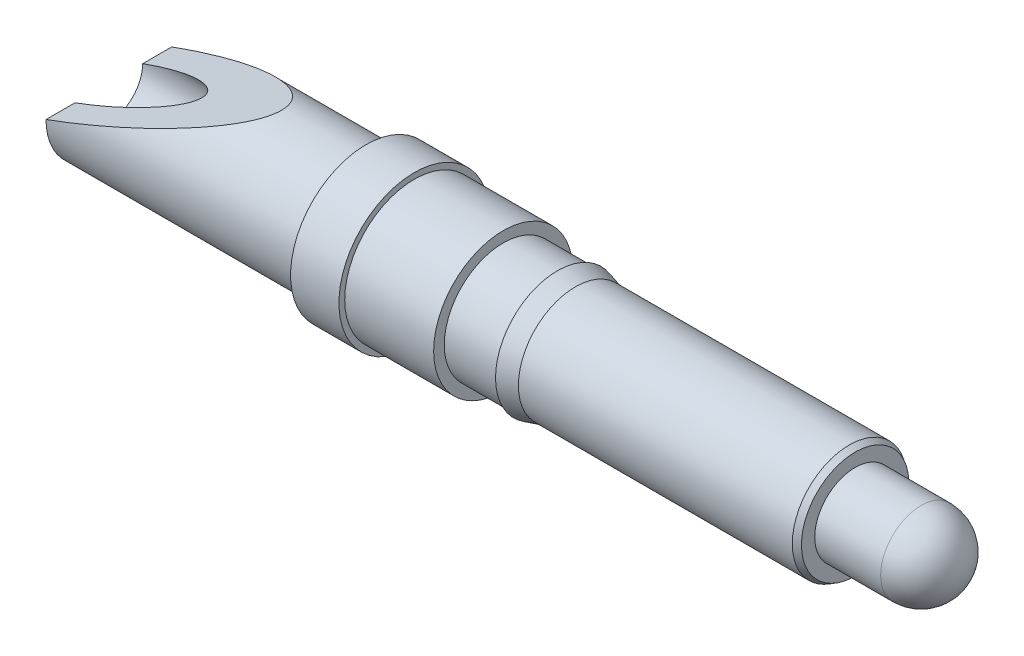
ISO-10303-21;
HEADER;
FILE_DESCRIPTION(('STEP AP214'),'2;1');
FILE_NAME('part.step','',(''),(''),'','','');
FILE_SCHEMA(('AUTOMOTIVE_DESIGN { 1 0 10303 214 1 1 1 1 }'));
ENDSEC;
DATA;
#1=APPLICATION_CONTEXT('core data for automotive mechanical design processes');
#2=APPLICATION_PROTOCOL_DEFINITION('international standard','automotive_design',2000,#1);
#3=PRODUCT_CONTEXT('',#1,'mechanical');
#4=PRODUCT('Part','Part','',(#3));
#5=PRODUCT_RELATED_PRODUCT_CATEGORY('part','',(#4));
#6=PRODUCT_DEFINITION_FORMATION('','',#4);
#7=PRODUCT_DEFINITION_CONTEXT('part definition',#1,'design');
#8=PRODUCT_DEFINITION('design','',#6,#7);
#9=PRODUCT_DEFINITION_SHAPE('','',#8);
#10=(LENGTH_UNIT() NAMED_UNIT(*) SI_UNIT(.MILLI.,.METRE.));
#11=(NAMED_UNIT(*) PLANE_ANGLE_UNIT() SI_UNIT($,.RADIAN.));
#12=(NAMED_UNIT(*) SI_UNIT($,.STERADIAN.) SOLID_ANGLE_UNIT());
#13=UNCERTAINTY_MEASURE_WITH_UNIT(LENGTH_MEASURE(1.E-05),#10,'distance_accuracy_value','');
#14=(GEOMETRIC_REPRESENTATION_CONTEXT(3) GLOBAL_UNCERTAINTY_ASSIGNED_CONTEXT((#13)) GLOBAL_UNIT_ASSIGNED_CONTEXT((#10,
#11,#12)) REPRESENTATION_CONTEXT('',''));
#15=CARTESIAN_POINT('',(0.,0.,0.));
#16=DIRECTION('',(0.,0.,1.));
#17=DIRECTION('',(1.,0.,0.));
#18=AXIS2_PLACEMENT_3D('',#15,#16,#17);
#19=CARTESIAN_POINT('',(5.79120000000002,0.705305909487725,0.));
#20=DIRECTION('',(-1.,0.,0.));
#21=DIRECTION('',(0.,0.,1.));
#22=AXIS2_PLACEMENT_3D('',#19,#20,#21);
#23=PLANE('',#22);
#24=CARTESIAN_POINT('',(5.79120000000002,0.,0.));
#25=DIRECTION('',(-1.,0.,0.));
#26=DIRECTION('',(0.,0.,1.));
#27=AXIS2_PLACEMENT_3D('',#24,#25,#26);
#28=CIRCLE('',#27,0.530859999999994);
#29=CARTESIAN_POINT('',(5.79120000000002,0.,0.530859999999994));
#30=VERTEX_POINT('',#29);
#31=EDGE_CURVE('E52',#30,#30,#28,.T.);
#32=ORIENTED_EDGE('',*,*,#31,.T.);
#33=EDGE_LOOP('',(#32));
#34=FACE_BOUND('',#33,.T.);
#35=CARTESIAN_POINT('',(5.79120000000001,0.,0.));
#36=DIRECTION('',(-1.,0.,0.));
#37=DIRECTION('',(0.,0.,1.));
#38=AXIS2_PLACEMENT_3D('',#35,#36,#37);
#39=CIRCLE('',#38,0.705305909487725);
#40=CARTESIAN_POINT('',(5.79120000000001,0.,0.705305909487725));
#41=VERTEX_POINT('',#40);
#42=EDGE_CURVE('E113',#41,#41,#39,.T.);
#43=ORIENTED_EDGE('',*,*,#42,.F.);
#44=EDGE_LOOP('',(#43));
#45=FACE_BOUND('',#44,.T.);
#46=ADVANCED_FACE('F44',(#34,#45),#23,.F.);
#47=CARTESIAN_POINT('',(5.79120000000001,0.,0.));
#48=DIRECTION('',(-1.,0.,0.));
#49=DIRECTION('',(0.,0.,1.));
#50=AXIS2_PLACEMENT_3D('',#47,#48,#49);
#51=CONICAL_SURFACE('',#50,0.705305909487725,0.523598775598293);
#52=CARTESIAN_POINT('',(5.715,0.,0.));
#53=DIRECTION('',(-1.,0.,0.));
#54=DIRECTION('',(0.,0.,1.));
#55=AXIS2_PLACEMENT_3D('',#52,#53,#54);
#56=CIRCLE('',#55,0.749299999999981);
#57=CARTESIAN_POINT('',(5.715,0.,0.749299999999981));
#58=VERTEX_POINT('',#57);
#59=EDGE_CURVE('E109',#58,#58,#56,.T.);
#60=ORIENTED_EDGE('',*,*,#59,.F.);
#61=EDGE_LOOP('',(#60));
#62=FACE_BOUND('',#61,.T.);
#63=ORIENTED_EDGE('',*,*,#42,.T.);
#64=EDGE_LOOP('',(#63));
#65=FACE_BOUND('',#64,.T.);
#66=ADVANCED_FACE('F164',(#62,#65),#51,.T.);
#67=CARTESIAN_POINT('',(0.,0.,0.));
#68=DIRECTION('',(-1.,0.,0.));
#69=DIRECTION('',(0.,0.,1.));
#70=AXIS2_PLACEMENT_3D('',#67,#68,#69);
#71=CYLINDRICAL_SURFACE('',#70,0.749299999999981);
#72=CARTESIAN_POINT('',(2.11658522628074,0.,0.));
#73=DIRECTION('',(-1.,0.,0.));
#74=DIRECTION('',(0.,0.,1.));
#75=AXIS2_PLACEMENT_3D('',#72,#73,#74);
#76=CIRCLE('',#75,0.749299999999981);
#77=CARTESIAN_POINT('',(2.11658522628074,0.,0.749299999999981));
#78=VERTEX_POINT('',#77);
#79=EDGE_CURVE('E105',#78,#78,#76,.T.);
#80=ORIENTED_EDGE('',*,*,#79,.F.);
#81=EDGE_LOOP('',(#80));
#82=FACE_BOUND('',#81,.T.);
#83=ORIENTED_EDGE('',*,*,#59,.T.);
#84=EDGE_LOOP('',(#83));
#85=FACE_BOUND('',#84,.T.);
#86=ADVANCED_FACE('F169',(#82,#85),#71,.T.);
#87=CARTESIAN_POINT('',(2.11658522628074,0.,0.));
#88=DIRECTION('',(-1.,0.,0.));
#89=DIRECTION('',(0.,0.,1.));
#90=AXIS2_PLACEMENT_3D('',#87,#88,#89);
#91=CONICAL_SURFACE('',#90,0.749299999999981,0.261799387799215);
#92=CARTESIAN_POINT('',(1.8796,0.,0.));
#93=DIRECTION('',(-1.,0.,0.));
#94=DIRECTION('',(0.,0.,1.));
#95=AXIS2_PLACEMENT_3D('',#92,#93,#94);
#96=CIRCLE('',#95,0.81280000000003);
#97=CARTESIAN_POINT('',(1.8796,0.,0.81280000000003));
#98=VERTEX_POINT('',#97);
#99=EDGE_CURVE('E101',#98,#98,#96,.T.);
#100=ORIENTED_EDGE('',*,*,#99,.F.);
#101=EDGE_LOOP('',(#100));
#102=FACE_BOUND('',#101,.T.);
#103=ORIENTED_EDGE('',*,*,#79,.T.);
#104=EDGE_LOOP('',(#103));
#105=FACE_BOUND('',#104,.T.);
#106=ADVANCED_FACE('F264',(#102,#105),#91,.T.);
#107=CARTESIAN_POINT('',(1.8796,0.774699999999989,0.));
#108=DIRECTION('',(1.,0.,0.));
#109=DIRECTION('',(0.,0.,-1.));
#110=AXIS2_PLACEMENT_3D('',#107,#108,#109);
#111=PLANE('',#110);
#112=CARTESIAN_POINT('',(1.8796,0.,0.));
#113=DIRECTION('',(-1.,0.,0.));
#114=DIRECTION('',(0.,0.,1.));
#115=AXIS2_PLACEMENT_3D('',#112,#113,#114);
#116=CIRCLE('',#115,0.774699999999989);
#117=CARTESIAN_POINT('',(1.8796,0.,0.774699999999989));
#118=VERTEX_POINT('',#117);
#119=EDGE_CURVE('E97',#118,#118,#116,.T.);
#120=ORIENTED_EDGE('',*,*,#119,.F.);
#121=EDGE_LOOP('',(#120));
#122=FACE_BOUND('',#121,.T.);
#123=ORIENTED_EDGE('',*,*,#99,.T.);
#124=EDGE_LOOP('',(#123));
#125=FACE_BOUND('',#124,.T.);
#126=ADVANCED_FACE('F254',(#122,#125),#111,.F.);
#127=CARTESIAN_POINT('',(0.,0.,0.));
#128=DIRECTION('',(-1.,0.,0.));
#129=DIRECTION('',(0.,0.,1.));
#130=AXIS2_PLACEMENT_3D('',#127,#128,#129);
#131=CYLINDRICAL_SURFACE('',#130,0.774699999999989);
#132=CARTESIAN_POINT('',(1.16840000000004,0.,0.));
#133=DIRECTION('',(-1.,0.,0.));
#134=DIRECTION('',(0.,0.,1.));
#135=AXIS2_PLACEMENT_3D('',#132,#133,#134);
#136=CIRCLE('',#135,0.774699999999989);
#137=CARTESIAN_POINT('',(1.16840000000004,0.,0.774699999999989));
#138=VERTEX_POINT('',#137);
#139=EDGE_CURVE('E90',#138,#138,#136,.T.);
#140=ORIENTED_EDGE('',*,*,#139,.F.);
#141=EDGE_LOOP('',(#140));
#142=FACE_BOUND('',#141,.T.);
#143=ORIENTED_EDGE('',*,*,#119,.T.);
#144=EDGE_LOOP('',(#143));
#145=FACE_BOUND('',#144,.T.);
#146=ADVANCED_FACE('F244',(#142,#145),#131,.T.);
#147=CARTESIAN_POINT('',(1.16840000000004,0.914399999999982,0.));
#148=DIRECTION('',(-1.,0.,0.));
#149=DIRECTION('',(0.,0.,1.));
#150=AXIS2_PLACEMENT_3D('',#147,#148,#149);
#151=PLANE('',#150);
#152=CARTESIAN_POINT('',(1.16840000000004,0.,0.));
#153=DIRECTION('',(-1.,0.,0.));
#154=DIRECTION('',(0.,0.,1.));
#155=AXIS2_PLACEMENT_3D('',#152,#153,#154);
#156=CIRCLE('',#155,0.914399999999982);
#157=CARTESIAN_POINT('',(1.16840000000004,0.,0.914399999999982));
#158=VERTEX_POINT('',#157);
#159=EDGE_CURVE('E86',#158,#158,#156,.T.);
#160=ORIENTED_EDGE('',*,*,#159,.F.);
#161=EDGE_LOOP('',(#160));
#162=FACE_BOUND('',#161,.T.);
#163=ORIENTED_EDGE('',*,*,#139,.T.);
#164=EDGE_LOOP('',(#163));
#165=FACE_BOUND('',#164,.T.);
#166=ADVANCED_FACE('F196',(#162,#165),#151,.F.);
#167=CARTESIAN_POINT('',(0.,0.,0.));
#168=DIRECTION('',(-1.,0.,0.));
#169=DIRECTION('',(0.,0.,1.));
#170=AXIS2_PLACEMENT_3D('',#167,#168,#169);
#171=CYLINDRICAL_SURFACE('',#170,0.914399999999982);
#172=CARTESIAN_POINT('',(0.,0.,0.));
#173=DIRECTION('',(-1.,0.,0.));
#174=DIRECTION('',(0.,0.,1.));
#175=AXIS2_PLACEMENT_3D('',#172,#173,#174);
#176=CIRCLE('',#175,0.914399999999982);
#177=CARTESIAN_POINT('',(0.,0.,0.914399999999982));
#178=VERTEX_POINT('',#177);
#179=EDGE_CURVE('E140',#178,#178,#176,.F.);
#180=ORIENTED_EDGE('',*,*,#179,.T.);
#181=EDGE_LOOP('',(#180));
#182=FACE_BOUND('',#181,.T.);
#183=ORIENTED_EDGE('',*,*,#159,.T.);
#184=EDGE_LOOP('',(#183));
#185=FACE_BOUND('',#184,.T.);
#186=ADVANCED_FACE('F190',(#182,#185),#171,.T.);
#187=CARTESIAN_POINT('',(-4.01319999999998,0.8255,0.));
#188=DIRECTION('',(1.,0.,0.));
#189=DIRECTION('',(0.,0.,-1.));
#190=AXIS2_PLACEMENT_3D('',#187,#188,#189);
#191=PLANE('',#190);
#192=DIRECTION('',(0.,0.,1.));
#193=VECTOR('',#192,1.);
#194=CARTESIAN_POINT('',(-4.01319999999998,0.,-0.889));
#195=LINE('',#194,#193);
#196=CARTESIAN_POINT('',(-4.01319999999998,0.,0.4445));
#197=VERTEX_POINT('',#196);
#198=CARTESIAN_POINT('',(-4.01319999999998,0.,0.8255));
#199=VERTEX_POINT('',#198);
#200=EDGE_CURVE('E68',#197,#199,#195,.T.);
#201=ORIENTED_EDGE('',*,*,#200,.F.);
#202=CARTESIAN_POINT('',(-4.01319999999998,0.,0.));
#203=DIRECTION('',(-1.,0.,0.));
#204=DIRECTION('',(0.,0.,1.));
#205=AXIS2_PLACEMENT_3D('',#202,#203,#204);
#206=CIRCLE('',#205,0.4445);
#207=CARTESIAN_POINT('',(-4.01319999999998,0.,-0.4445));
#208=VERTEX_POINT('',#207);
#209=EDGE_CURVE('E57',#208,#197,#206,.T.);
#210=ORIENTED_EDGE('',*,*,#209,.F.);
#211=CARTESIAN_POINT('',(-4.01319999999998,0.,-0.8255));
#212=VERTEX_POINT('',#211);
#213=EDGE_CURVE('E117',#212,#208,#195,.T.);
#214=ORIENTED_EDGE('',*,*,#213,.F.);
#215=CARTESIAN_POINT('',(-4.01319999999998,0.,0.));
#216=DIRECTION('',(1.,0.,0.));
#217=DIRECTION('',(0.,0.,-1.));
#218=AXIS2_PLACEMENT_3D('',#215,#216,#217);
#219=CIRCLE('',#218,0.8255);
#220=EDGE_CURVE('E136',#199,#212,#219,.T.);
#221=ORIENTED_EDGE('',*,*,#220,.F.);
#222=EDGE_LOOP('',(#201,#210,#214,#221));
#223=FACE_BOUND('',#222,.T.);
#224=ADVANCED_FACE('F187',(#223),#191,.F.);
#225=CARTESIAN_POINT('',(3.04800000000003,0.,0.));
#226=DIRECTION('',(1.,0.,0.));
#227=DIRECTION('',(0.,0.,-1.));
#228=AXIS2_PLACEMENT_3D('',#225,#226,#227);
#229=CYLINDRICAL_SURFACE('',#228,0.8255);
#230=CARTESIAN_POINT('',(-0.634999999999979,0.,0.));
#231=DIRECTION('',(1.,0.,0.));
#232=DIRECTION('',(0.,0.,-1.));
#233=AXIS2_PLACEMENT_3D('',#230,#231,#232);
#234=CIRCLE('',#233,0.8255);
#235=CARTESIAN_POINT('',(-0.634999999999979,0.,-0.8255));
#236=VERTEX_POINT('',#235);
#237=EDGE_CURVE('E132',#236,#236,#234,.T.);
#238=ORIENTED_EDGE('',*,*,#237,.F.);
#239=EDGE_LOOP('',(#238));
#240=FACE_BOUND('',#239,.T.);
#241=CARTESIAN_POINT('',(-4.01319999999998,0.,0.));
#242=DIRECTION('',(-0.342020143325662,0.939692620785911,0.));
#243=DIRECTION('',(0.939692620785911,0.342020143325662,0.));
#244=AXIS2_PLACEMENT_3D('',#241,#242,#243);
#245=ELLIPSE('',#244,2.41360053233467,0.8255);
#246=EDGE_CURVE('E121',#199,#212,#245,.T.);
#247=ORIENTED_EDGE('',*,*,#246,.F.);
#248=ORIENTED_EDGE('',*,*,#220,.T.);
#249=EDGE_LOOP('',(#247,#248));
#250=FACE_BOUND('',#249,.T.);
#251=ADVANCED_FACE('F184',(#240,#250),#229,.T.);
#252=CARTESIAN_POINT('',(-0.634999999999979,0.9906,0.));
#253=DIRECTION('',(1.,0.,0.));
#254=DIRECTION('',(0.,0.,-1.));
#255=AXIS2_PLACEMENT_3D('',#252,#253,#254);
#256=PLANE('',#255);
#257=CARTESIAN_POINT('',(-0.634999999999979,0.,0.));
#258=DIRECTION('',(1.,0.,0.));
#259=DIRECTION('',(0.,0.,-1.));
#260=AXIS2_PLACEMENT_3D('',#257,#258,#259);
#261=CIRCLE('',#260,0.9906);
#262=CARTESIAN_POINT('',(-0.634999999999979,0.,-0.9906));
#263=VERTEX_POINT('',#262);
#264=EDGE_CURVE('E128',#263,#263,#261,.T.);
#265=ORIENTED_EDGE('',*,*,#264,.F.);
#266=EDGE_LOOP('',(#265));
#267=FACE_BOUND('',#266,.T.);
#268=ORIENTED_EDGE('',*,*,#237,.T.);
#269=EDGE_LOOP('',(#268));
#270=FACE_BOUND('',#269,.T.);
#271=ADVANCED_FACE('F180',(#267,#270),#256,.F.);
#272=CARTESIAN_POINT('',(3.04800000000003,0.,0.));
#273=DIRECTION('',(1.,0.,0.));
#274=DIRECTION('',(0.,0.,-1.));
#275=AXIS2_PLACEMENT_3D('',#272,#273,#274);
#276=CYLINDRICAL_SURFACE('',#275,0.9906);
#277=CARTESIAN_POINT('',(0.,0.,0.));
#278=DIRECTION('',(1.,0.,0.));
#279=DIRECTION('',(0.,0.,-1.));
#280=AXIS2_PLACEMENT_3D('',#277,#278,#279);
#281=CIRCLE('',#280,0.9906);
#282=CARTESIAN_POINT('',(0.,0.,-0.9906));
#283=VERTEX_POINT('',#282);
#284=EDGE_CURVE('E124',#283,#283,#281,.T.);
#285=ORIENTED_EDGE('',*,*,#284,.F.);
#286=EDGE_LOOP('',(#285));
#287=FACE_BOUND('',#286,.T.);
#288=ORIENTED_EDGE('',*,*,#264,.T.);
#289=EDGE_LOOP('',(#288));
#290=FACE_BOUND('',#289,.T.);
#291=ADVANCED_FACE('F176',(#287,#290),#276,.T.);
#292=CARTESIAN_POINT('',(0.,0.654049999999989,0.));
#293=DIRECTION('',(-1.,0.,0.));
#294=DIRECTION('',(0.,0.,1.));
#295=AXIS2_PLACEMENT_3D('',#292,#293,#294);
#296=PLANE('',#295);
#297=ORIENTED_EDGE('',*,*,#179,.F.);
#298=EDGE_LOOP('',(#297));
#299=FACE_BOUND('',#298,.T.);
#300=ORIENTED_EDGE('',*,*,#284,.T.);
#301=EDGE_LOOP('',(#300));
#302=FACE_BOUND('',#301,.T.);
#303=ADVANCED_FACE('F160',(#299,#302),#296,.F.);
#304=CARTESIAN_POINT('',(-4.01319999999998,0.,-0.889));
#305=DIRECTION('',(-0.342020143325662,0.939692620785911,0.));
#306=DIRECTION('',(0.939692620785911,0.342020143325662,0.));
#307=AXIS2_PLACEMENT_3D('',#304,#305,#306);
#308=PLANE('',#307);
#309=CARTESIAN_POINT('',(-4.01319999999998,0.,0.));
#310=DIRECTION('',(-0.342020143325662,0.939692620785911,0.));
#311=DIRECTION('',(-0.939692620785911,-0.342020143325662,0.));
#312=AXIS2_PLACEMENT_3D('',#309,#310,#311);
#313=ELLIPSE('',#312,1.29963105587252,0.4445);
#314=EDGE_CURVE('E11',#197,#208,#313,.T.);
#315=ORIENTED_EDGE('',*,*,#314,.F.);
#316=ORIENTED_EDGE('',*,*,#200,.T.);
#317=ORIENTED_EDGE('',*,*,#246,.T.);
#318=ORIENTED_EDGE('',*,*,#213,.T.);
#319=EDGE_LOOP('',(#315,#316,#317,#318));
#320=FACE_BOUND('',#319,.T.);
#321=ADVANCED_FACE('F153',(#320),#308,.T.);
#322=CARTESIAN_POINT('',(2.69240000000003,0.,0.));
#323=DIRECTION('',(-1.,0.,0.));
#324=DIRECTION('',(0.,-0.821440557877343,-0.57029414329288));
#325=AXIS2_PLACEMENT_3D('',#322,#323,#324);
#326=CYLINDRICAL_SURFACE('',#325,0.530859999999994);
#327=CARTESIAN_POINT('',(6.65734000000004,0.,0.));
#328=DIRECTION('',(-1.,0.,0.));
#329=DIRECTION('',(0.,-0.821440557877343,-0.57029414329288));
#330=AXIS2_PLACEMENT_3D('',#327,#328,#329);
#331=CIRCLE('',#330,0.530859999999994);
#332=CARTESIAN_POINT('',(6.65734000000004,-0.43606993455476,-0.302746348908455));
#333=VERTEX_POINT('',#332);
#334=EDGE_CURVE('E144',#333,#333,#331,.T.);
#335=ORIENTED_EDGE('',*,*,#334,.T.);
#336=EDGE_LOOP('',(#335));
#337=FACE_BOUND('',#336,.T.);
#338=ORIENTED_EDGE('',*,*,#31,.F.);
#339=EDGE_LOOP('',(#338));
#340=FACE_BOUND('',#339,.T.);
#341=ADVANCED_FACE('F152',(#337,#340),#326,.T.);
#342=CARTESIAN_POINT('',(6.65734000000004,0.,0.));
#343=DIRECTION('',(-1.,0.,0.));
#344=DIRECTION('',(0.,0.821440557877343,0.57029414329288));
#345=AXIS2_PLACEMENT_3D('',#342,#343,#344);
#346=SPHERICAL_SURFACE('',#345,0.530859999999994);
#347=ORIENTED_EDGE('',*,*,#334,.F.);
#348=EDGE_LOOP('',(#347));
#349=FACE_BOUND('',#348,.T.);
#350=ADVANCED_FACE('F46',(#349),#346,.T.);
#351=CARTESIAN_POINT('',(0.558800000000014,0.,0.));
#352=DIRECTION('',(-1.,0.,0.));
#353=DIRECTION('',(0.,0.,1.));
#354=AXIS2_PLACEMENT_3D('',#351,#352,#353);
#355=CONICAL_SURFACE('',#354,0.444499999999999,1.02974425867665);
#356=CARTESIAN_POINT('',(0.825882545157768,0.,0.));
#357=VERTEX_POINT('',#356);
#358=VERTEX_LOOP('',#357);
#359=FACE_BOUND('',#358,.T.);
#360=CARTESIAN_POINT('',(0.558800000000014,0.,0.));
#361=DIRECTION('',(-1.,0.,0.));
#362=DIRECTION('',(0.,0.,1.));
#363=AXIS2_PLACEMENT_3D('',#360,#361,#362);
#364=CIRCLE('',#363,0.444499999999999);
#365=CARTESIAN_POINT('',(0.558800000000014,0.,0.444499999999999));
#366=VERTEX_POINT('',#365);
#367=EDGE_CURVE('E84',#366,#366,#364,.T.);
#368=ORIENTED_EDGE('',*,*,#367,.T.);
#369=EDGE_LOOP('',(#368));
#370=FACE_BOUND('',#369,.T.);
#371=ADVANCED_FACE('F77',(#359,#370),#355,.F.);
#372=CARTESIAN_POINT('',(-4.01319999999998,0.,0.));
#373=DIRECTION('',(-1.,0.,0.));
#374=DIRECTION('',(0.,0.,1.));
#375=AXIS2_PLACEMENT_3D('',#372,#373,#374);
#376=CYLINDRICAL_SURFACE('',#375,0.4445);
#377=ORIENTED_EDGE('',*,*,#314,.T.);
#378=ORIENTED_EDGE('',*,*,#209,.T.);
#379=EDGE_LOOP('',(#377,#378));
#380=FACE_BOUND('',#379,.T.);
#381=ORIENTED_EDGE('',*,*,#367,.F.);
#382=EDGE_LOOP('',(#381));
#383=FACE_BOUND('',#382,.T.);
#384=ADVANCED_FACE('F80',(#380,#383),#376,.F.);
#385=CLOSED_SHELL('',(#46,#66,#86,#106,#126,#146,#166,#186,#224,#251,#271,#291,#303,#321,#341,
#350,#371,#384));
#386=MANIFOLD_SOLID_BREP('B2',#385);
#387=ADVANCED_BREP_SHAPE_REPRESENTATION('',(#18,#386),#14);
#388=SHAPE_DEFINITION_REPRESENTATION(#9,#387);
ENDSEC;
END-ISO-10303-21;
